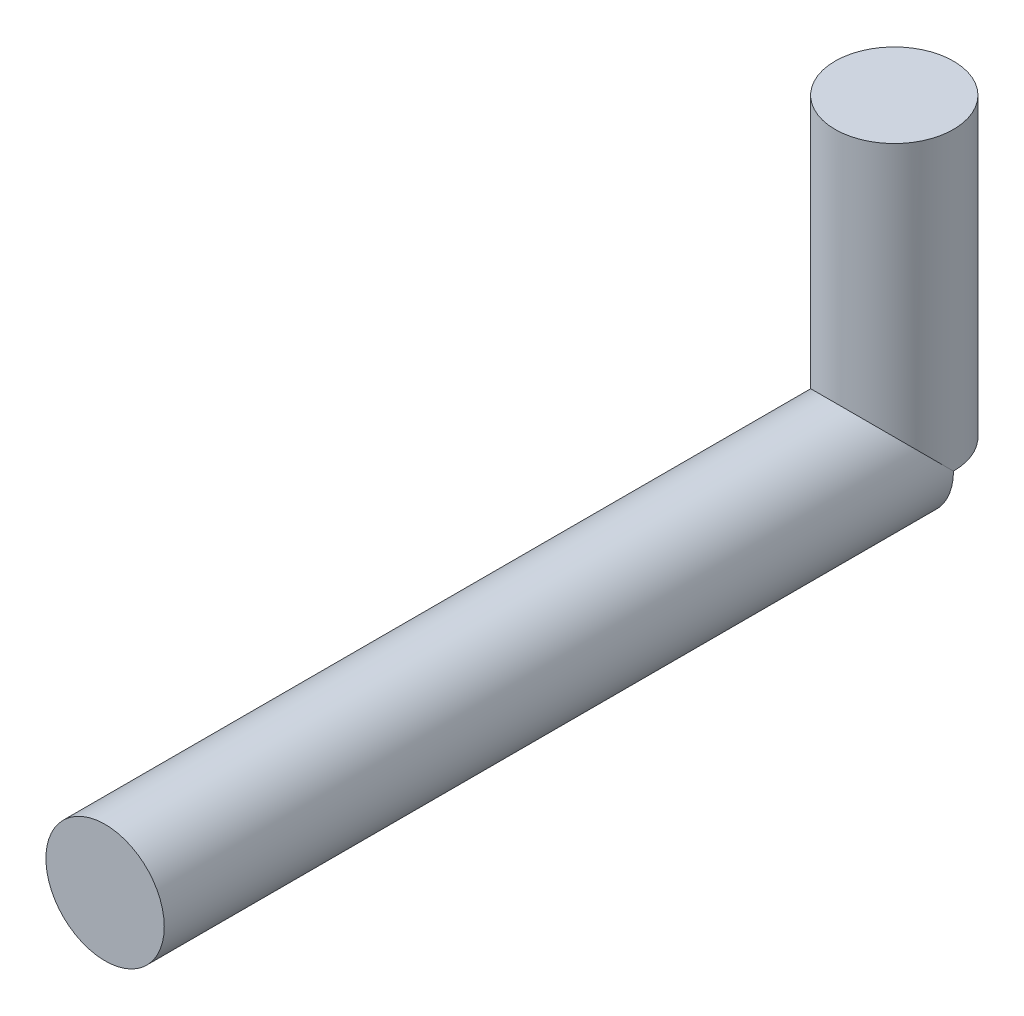
ISO-10303-21;
HEADER;
FILE_DESCRIPTION(('STEP AP214'),'2;1');
FILE_NAME('part.step','',(''),(''),'','','');
FILE_SCHEMA(('AUTOMOTIVE_DESIGN { 1 0 10303 214 1 1 1 1 }'));
ENDSEC;
DATA;
#1=APPLICATION_CONTEXT('core data for automotive mechanical design processes');
#2=APPLICATION_PROTOCOL_DEFINITION('international standard','automotive_design',2000,#1);
#3=PRODUCT_CONTEXT('',#1,'mechanical');
#4=PRODUCT('Part','Part','',(#3));
#5=PRODUCT_RELATED_PRODUCT_CATEGORY('part','',(#4));
#6=PRODUCT_DEFINITION_FORMATION('','',#4);
#7=PRODUCT_DEFINITION_CONTEXT('part definition',#1,'design');
#8=PRODUCT_DEFINITION('design','',#6,#7);
#9=PRODUCT_DEFINITION_SHAPE('','',#8);
#10=(LENGTH_UNIT() NAMED_UNIT(*) SI_UNIT(.MILLI.,.METRE.));
#11=(NAMED_UNIT(*) PLANE_ANGLE_UNIT() SI_UNIT($,.RADIAN.));
#12=(NAMED_UNIT(*) SI_UNIT($,.STERADIAN.) SOLID_ANGLE_UNIT());
#13=UNCERTAINTY_MEASURE_WITH_UNIT(LENGTH_MEASURE(1.E-05),#10,'distance_accuracy_value','');
#14=(GEOMETRIC_REPRESENTATION_CONTEXT(3) GLOBAL_UNCERTAINTY_ASSIGNED_CONTEXT((#13)) GLOBAL_UNIT_ASSIGNED_CONTEXT((#10,
#11,#12)) REPRESENTATION_CONTEXT('',''));
#15=CARTESIAN_POINT('',(0.,0.,0.));
#16=DIRECTION('',(0.,0.,1.));
#17=DIRECTION('',(1.,0.,0.));
#18=AXIS2_PLACEMENT_3D('',#15,#16,#17);
#19=CARTESIAN_POINT('',(0.,0.,4.));
#20=DIRECTION('',(0.,0.,-1.));
#21=DIRECTION('',(-1.,0.,0.));
#22=AXIS2_PLACEMENT_3D('',#19,#20,#21);
#23=CYLINDRICAL_SURFACE('',#22,0.3);
#24=CARTESIAN_POINT('',(0.,0.,4.));
#25=DIRECTION('',(0.,0.,1.));
#26=DIRECTION('',(1.,0.,0.));
#27=AXIS2_PLACEMENT_3D('',#24,#25,#26);
#28=CIRCLE('',#27,0.3);
#29=CARTESIAN_POINT('',(0.3,0.,4.));
#30=VERTEX_POINT('',#29);
#31=EDGE_CURVE('E41',#30,#30,#28,.T.);
#32=ORIENTED_EDGE('',*,*,#31,.F.);
#33=EDGE_LOOP('',(#32));
#34=FACE_BOUND('',#33,.T.);
#35=CARTESIAN_POINT('',(0.,0.,0.));
#36=DIRECTION('',(0.,0.707106781186547,-0.707106781186547));
#37=DIRECTION('',(0.,-0.707106781186547,-0.707106781186547));
#38=AXIS2_PLACEMENT_3D('',#35,#36,#37);
#39=ELLIPSE('',#38,0.424264068711928,0.3);
#40=CARTESIAN_POINT('',(-0.3,0.,0.));
#41=VERTEX_POINT('',#40);
#42=CARTESIAN_POINT('',(0.3,0.,0.));
#43=VERTEX_POINT('',#42);
#44=EDGE_CURVE('E52',#41,#43,#39,.T.);
#45=ORIENTED_EDGE('',*,*,#44,.F.);
#46=CARTESIAN_POINT('',(0.,0.,0.));
#47=DIRECTION('',(0.,0.,1.));
#48=DIRECTION('',(1.,0.,0.));
#49=AXIS2_PLACEMENT_3D('',#46,#47,#48);
#50=CIRCLE('',#49,0.3);
#51=EDGE_CURVE('E47',#41,#43,#50,.T.);
#52=ORIENTED_EDGE('',*,*,#51,.T.);
#53=EDGE_LOOP('',(#45,#52));
#54=FACE_BOUND('',#53,.T.);
#55=ADVANCED_FACE('F34',(#34,#54),#23,.T.);
#56=CARTESIAN_POINT('',(0.,0.,0.));
#57=DIRECTION('',(0.,0.,1.));
#58=DIRECTION('',(1.,0.,0.));
#59=AXIS2_PLACEMENT_3D('',#56,#57,#58);
#60=PLANE('',#59);
#61=DIRECTION('',(-1.,0.,0.));
#62=VECTOR('',#61,1.);
#63=CARTESIAN_POINT('',(0.,0.,0.));
#64=LINE('',#63,#62);
#65=EDGE_CURVE('E11',#43,#41,#64,.T.);
#66=ORIENTED_EDGE('',*,*,#65,.F.);
#67=ORIENTED_EDGE('',*,*,#51,.F.);
#68=EDGE_LOOP('',(#66,#67));
#69=FACE_BOUND('',#68,.T.);
#70=ADVANCED_FACE('F49',(#69),#60,.F.);
#71=CARTESIAN_POINT('',(0.,0.,4.));
#72=DIRECTION('',(0.,0.,1.));
#73=DIRECTION('',(1.,0.,0.));
#74=AXIS2_PLACEMENT_3D('',#71,#72,#73);
#75=PLANE('',#74);
#76=ORIENTED_EDGE('',*,*,#31,.T.);
#77=EDGE_LOOP('',(#76));
#78=FACE_BOUND('',#77,.T.);
#79=ADVANCED_FACE('F69',(#78),#75,.T.);
#80=CARTESIAN_POINT('',(0.,1.5,0.));
#81=DIRECTION('',(0.,-1.,0.));
#82=DIRECTION('',(0.,0.,-1.));
#83=AXIS2_PLACEMENT_3D('',#80,#81,#82);
#84=CYLINDRICAL_SURFACE('',#83,0.3);
#85=CARTESIAN_POINT('',(0.,1.5,0.));
#86=DIRECTION('',(0.,1.,0.));
#87=DIRECTION('',(0.,0.,1.));
#88=AXIS2_PLACEMENT_3D('',#85,#86,#87);
#89=CIRCLE('',#88,0.3);
#90=CARTESIAN_POINT('',(0.,1.5,0.3));
#91=VERTEX_POINT('',#90);
#92=EDGE_CURVE('E56',#91,#91,#89,.T.);
#93=ORIENTED_EDGE('',*,*,#92,.F.);
#94=EDGE_LOOP('',(#93));
#95=FACE_BOUND('',#94,.T.);
#96=CARTESIAN_POINT('',(0.,0.,0.));
#97=DIRECTION('',(0.,1.,0.));
#98=DIRECTION('',(0.,0.,1.));
#99=AXIS2_PLACEMENT_3D('',#96,#97,#98);
#100=CIRCLE('',#99,0.3);
#101=EDGE_CURVE('E60',#43,#41,#100,.T.);
#102=ORIENTED_EDGE('',*,*,#101,.T.);
#103=ORIENTED_EDGE('',*,*,#44,.T.);
#104=EDGE_LOOP('',(#102,#103));
#105=FACE_BOUND('',#104,.T.);
#106=ADVANCED_FACE('F61',(#95,#105),#84,.T.);
#107=CARTESIAN_POINT('',(0.,0.,0.));
#108=DIRECTION('',(0.,1.,0.));
#109=DIRECTION('',(0.,0.,1.));
#110=AXIS2_PLACEMENT_3D('',#107,#108,#109);
#111=PLANE('',#110);
#112=ORIENTED_EDGE('',*,*,#101,.F.);
#113=ORIENTED_EDGE('',*,*,#65,.T.);
#114=EDGE_LOOP('',(#112,#113));
#115=FACE_BOUND('',#114,.T.);
#116=ADVANCED_FACE('F59',(#115),#111,.F.);
#117=CARTESIAN_POINT('',(0.,1.5,0.));
#118=DIRECTION('',(0.,1.,0.));
#119=DIRECTION('',(0.,0.,1.));
#120=AXIS2_PLACEMENT_3D('',#117,#118,#119);
#121=PLANE('',#120);
#122=ORIENTED_EDGE('',*,*,#92,.T.);
#123=EDGE_LOOP('',(#122));
#124=FACE_BOUND('',#123,.T.);
#125=ADVANCED_FACE('F85',(#124),#121,.T.);
#126=CLOSED_SHELL('',(#55,#70,#79,#106,#116,#125));
#127=MANIFOLD_SOLID_BREP('B2',#126);
#128=ADVANCED_BREP_SHAPE_REPRESENTATION('',(#18,#127),#14);
#129=SHAPE_DEFINITION_REPRESENTATION(#9,#128);
ENDSEC;
END-ISO-10303-21;
